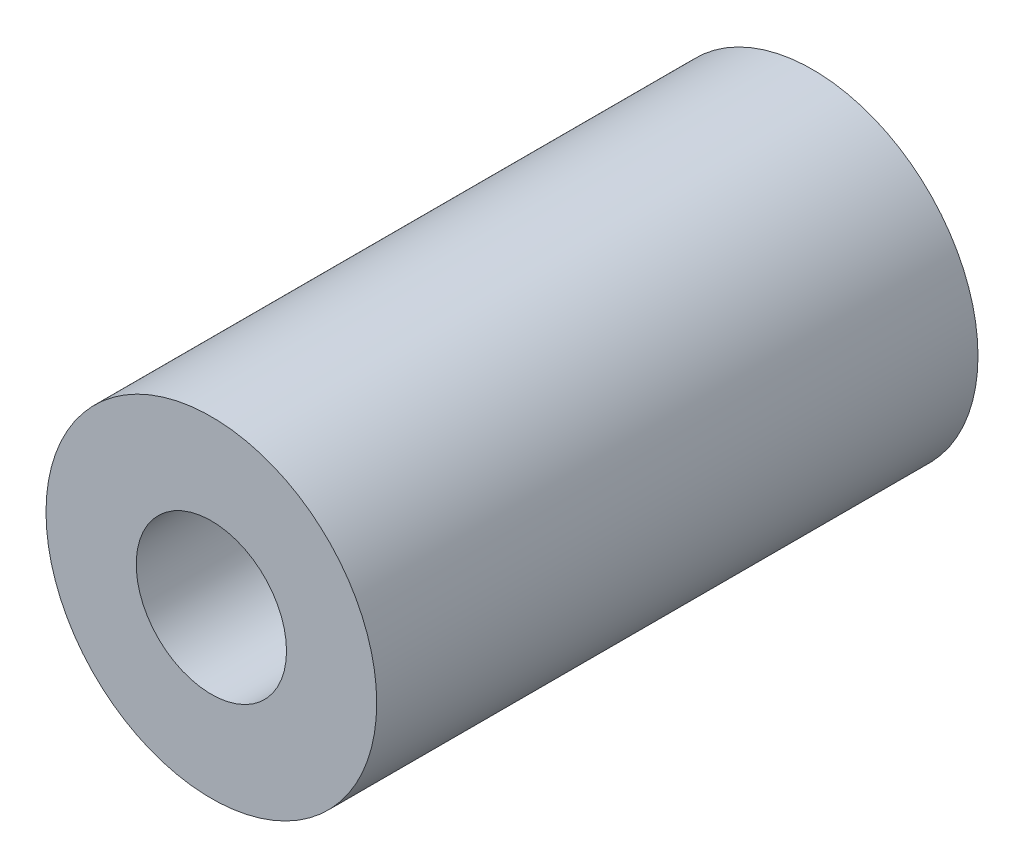
ISO-10303-21;
HEADER;
FILE_DESCRIPTION(('STEP AP214'),'2;1');
FILE_NAME('part.step','',(''),(''),'','','');
FILE_SCHEMA(('AUTOMOTIVE_DESIGN { 1 0 10303 214 1 1 1 1 }'));
ENDSEC;
DATA;
#1=APPLICATION_CONTEXT('core data for automotive mechanical design processes');
#2=APPLICATION_PROTOCOL_DEFINITION('international standard','automotive_design',2000,#1);
#3=PRODUCT_CONTEXT('',#1,'mechanical');
#4=PRODUCT('Part','Part','',(#3));
#5=PRODUCT_RELATED_PRODUCT_CATEGORY('part','',(#4));
#6=PRODUCT_DEFINITION_FORMATION('','',#4);
#7=PRODUCT_DEFINITION_CONTEXT('part definition',#1,'design');
#8=PRODUCT_DEFINITION('design','',#6,#7);
#9=PRODUCT_DEFINITION_SHAPE('','',#8);
#10=(LENGTH_UNIT() NAMED_UNIT(*) SI_UNIT(.MILLI.,.METRE.));
#11=(NAMED_UNIT(*) PLANE_ANGLE_UNIT() SI_UNIT($,.RADIAN.));
#12=(NAMED_UNIT(*) SI_UNIT($,.STERADIAN.) SOLID_ANGLE_UNIT());
#13=UNCERTAINTY_MEASURE_WITH_UNIT(LENGTH_MEASURE(1.E-05),#10,'distance_accuracy_value','');
#14=(GEOMETRIC_REPRESENTATION_CONTEXT(3) GLOBAL_UNCERTAINTY_ASSIGNED_CONTEXT((#13)) GLOBAL_UNIT_ASSIGNED_CONTEXT((#10,
#11,#12)) REPRESENTATION_CONTEXT('',''));
#15=CARTESIAN_POINT('',(0.,0.,0.));
#16=DIRECTION('',(0.,0.,1.));
#17=DIRECTION('',(1.,0.,0.));
#18=AXIS2_PLACEMENT_3D('',#15,#16,#17);
#19=CARTESIAN_POINT('',(0.,0.,80.));
#20=DIRECTION('',(0.,0.,1.));
#21=DIRECTION('',(1.,0.,0.));
#22=AXIS2_PLACEMENT_3D('',#19,#20,#21);
#23=PLANE('',#22);
#24=CARTESIAN_POINT('',(0.,0.,80.));
#25=DIRECTION('',(0.,0.,1.));
#26=DIRECTION('',(1.,0.,0.));
#27=AXIS2_PLACEMENT_3D('',#24,#25,#26);
#28=CIRCLE('',#27,22.);
#29=CARTESIAN_POINT('',(22.,0.,80.));
#30=VERTEX_POINT('',#29);
#31=EDGE_CURVE('E10',#30,#30,#28,.T.);
#32=ORIENTED_EDGE('',*,*,#31,.T.);
#33=EDGE_LOOP('',(#32));
#34=FACE_BOUND('',#33,.T.);
#35=CARTESIAN_POINT('',(0.,0.,80.));
#36=DIRECTION('',(0.,0.,1.));
#37=DIRECTION('',(1.,0.,0.));
#38=AXIS2_PLACEMENT_3D('',#35,#36,#37);
#39=CIRCLE('',#38,10.);
#40=CARTESIAN_POINT('',(10.,0.,80.));
#41=VERTEX_POINT('',#40);
#42=EDGE_CURVE('E47',#41,#41,#39,.T.);
#43=ORIENTED_EDGE('',*,*,#42,.F.);
#44=EDGE_LOOP('',(#43));
#45=FACE_BOUND('',#44,.T.);
#46=ADVANCED_FACE('F36',(#34,#45),#23,.T.);
#47=CARTESIAN_POINT('',(0.,0.,0.));
#48=DIRECTION('',(0.,0.,1.));
#49=DIRECTION('',(1.,0.,0.));
#50=AXIS2_PLACEMENT_3D('',#47,#48,#49);
#51=PLANE('',#50);
#52=CARTESIAN_POINT('',(0.,0.,0.));
#53=DIRECTION('',(0.,0.,1.));
#54=DIRECTION('',(1.,0.,0.));
#55=AXIS2_PLACEMENT_3D('',#52,#53,#54);
#56=CIRCLE('',#55,22.);
#57=CARTESIAN_POINT('',(22.,0.,0.));
#58=VERTEX_POINT('',#57);
#59=EDGE_CURVE('E40',#58,#58,#56,.T.);
#60=ORIENTED_EDGE('',*,*,#59,.F.);
#61=EDGE_LOOP('',(#60));
#62=FACE_BOUND('',#61,.T.);
#63=CARTESIAN_POINT('',(0.,0.,0.));
#64=DIRECTION('',(0.,0.,1.));
#65=DIRECTION('',(1.,0.,0.));
#66=AXIS2_PLACEMENT_3D('',#63,#64,#65);
#67=CIRCLE('',#66,10.);
#68=CARTESIAN_POINT('',(10.,0.,0.));
#69=VERTEX_POINT('',#68);
#70=EDGE_CURVE('E49',#69,#69,#67,.T.);
#71=ORIENTED_EDGE('',*,*,#70,.T.);
#72=EDGE_LOOP('',(#71));
#73=FACE_BOUND('',#72,.T.);
#74=ADVANCED_FACE('F59',(#62,#73),#51,.F.);
#75=CARTESIAN_POINT('',(0.,0.,80.));
#76=DIRECTION('',(0.,0.,-1.));
#77=DIRECTION('',(-1.,0.,0.));
#78=AXIS2_PLACEMENT_3D('',#75,#76,#77);
#79=CYLINDRICAL_SURFACE('',#78,22.);
#80=ORIENTED_EDGE('',*,*,#31,.F.);
#81=EDGE_LOOP('',(#80));
#82=FACE_BOUND('',#81,.T.);
#83=ORIENTED_EDGE('',*,*,#59,.T.);
#84=EDGE_LOOP('',(#83));
#85=FACE_BOUND('',#84,.T.);
#86=ADVANCED_FACE('F38',(#82,#85),#79,.T.);
#87=CARTESIAN_POINT('',(0.,0.,80.));
#88=DIRECTION('',(0.,0.,-1.));
#89=DIRECTION('',(-1.,0.,0.));
#90=AXIS2_PLACEMENT_3D('',#87,#88,#89);
#91=CYLINDRICAL_SURFACE('',#90,10.);
#92=ORIENTED_EDGE('',*,*,#42,.T.);
#93=EDGE_LOOP('',(#92));
#94=FACE_BOUND('',#93,.T.);
#95=ORIENTED_EDGE('',*,*,#70,.F.);
#96=EDGE_LOOP('',(#95));
#97=FACE_BOUND('',#96,.T.);
#98=ADVANCED_FACE('F55',(#94,#97),#91,.F.);
#99=CLOSED_SHELL('',(#46,#74,#86,#98));
#100=MANIFOLD_SOLID_BREP('B2',#99);
#101=ADVANCED_BREP_SHAPE_REPRESENTATION('',(#18,#100),#14);
#102=SHAPE_DEFINITION_REPRESENTATION(#9,#101);
ENDSEC;
END-ISO-10303-21;
